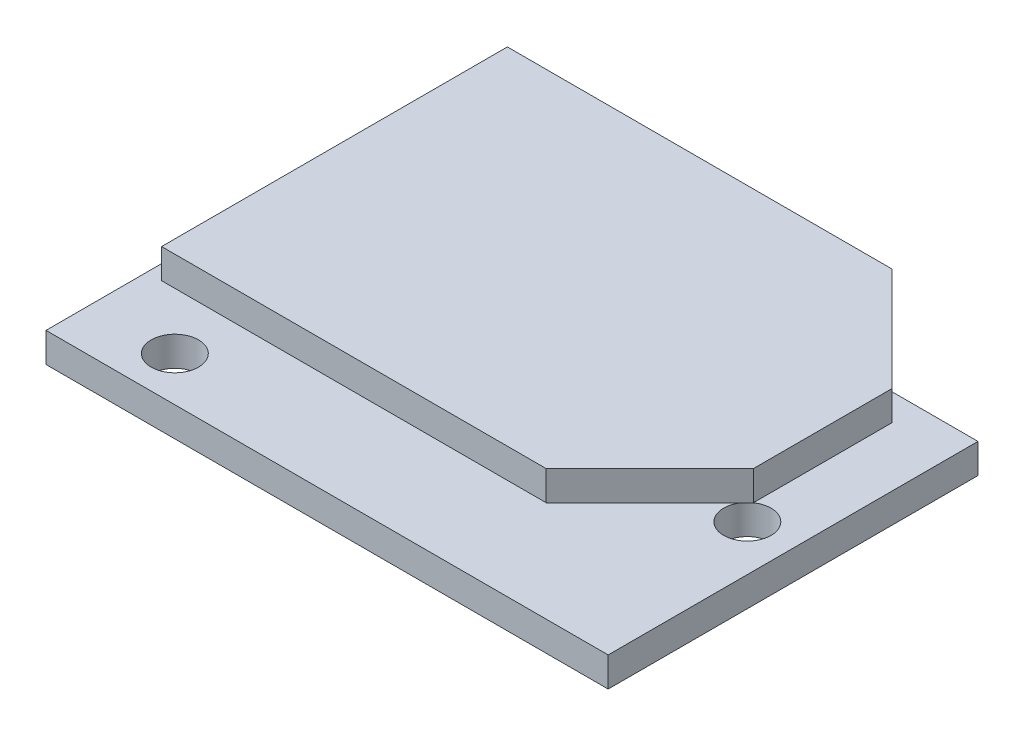
ISO-10303-21;
HEADER;
FILE_DESCRIPTION(('STEP AP214'),'2;1');
FILE_NAME('part.step','',(''),(''),'','','');
FILE_SCHEMA(('AUTOMOTIVE_DESIGN { 1 0 10303 214 1 1 1 1 }'));
ENDSEC;
DATA;
#1=APPLICATION_CONTEXT('core data for automotive mechanical design processes');
#2=APPLICATION_PROTOCOL_DEFINITION('international standard','automotive_design',2000,#1);
#3=PRODUCT_CONTEXT('',#1,'mechanical');
#4=PRODUCT('Part','Part','',(#3));
#5=PRODUCT_RELATED_PRODUCT_CATEGORY('part','',(#4));
#6=PRODUCT_DEFINITION_FORMATION('','',#4);
#7=PRODUCT_DEFINITION_CONTEXT('part definition',#1,'design');
#8=PRODUCT_DEFINITION('design','',#6,#7);
#9=PRODUCT_DEFINITION_SHAPE('','',#8);
#10=(LENGTH_UNIT() NAMED_UNIT(*) SI_UNIT(.MILLI.,.METRE.));
#11=(NAMED_UNIT(*) PLANE_ANGLE_UNIT() SI_UNIT($,.RADIAN.));
#12=(NAMED_UNIT(*) SI_UNIT($,.STERADIAN.) SOLID_ANGLE_UNIT());
#13=UNCERTAINTY_MEASURE_WITH_UNIT(LENGTH_MEASURE(1.E-05),#10,'distance_accuracy_value','');
#14=(GEOMETRIC_REPRESENTATION_CONTEXT(3) GLOBAL_UNCERTAINTY_ASSIGNED_CONTEXT((#13)) GLOBAL_UNIT_ASSIGNED_CONTEXT((#10,
#11,#12)) REPRESENTATION_CONTEXT('',''));
#15=CARTESIAN_POINT('',(0.,0.,0.));
#16=DIRECTION('',(0.,0.,1.));
#17=DIRECTION('',(1.,0.,0.));
#18=AXIS2_PLACEMENT_3D('',#15,#16,#17);
#19=CARTESIAN_POINT('',(7.,10.,-11.6864188731344));
#20=DIRECTION('',(1.,0.,0.));
#21=DIRECTION('',(0.,0.,-1.));
#22=AXIS2_PLACEMENT_3D('',#19,#20,#21);
#23=PLANE('',#22);
#24=DIRECTION('',(0.,0.,1.));
#25=VECTOR('',#24,1.);
#26=CARTESIAN_POINT('',(7.,8.,-11.6864188731344));
#27=LINE('',#26,#25);
#28=CARTESIAN_POINT('',(7.,8.,-11.6864188731344));
#29=VERTEX_POINT('',#28);
#30=CARTESIAN_POINT('',(7.,8.,11.6864188731344));
#31=VERTEX_POINT('',#30);
#32=EDGE_CURVE('E127',#29,#31,#27,.T.);
#33=ORIENTED_EDGE('',*,*,#32,.T.);
#34=DIRECTION('',(0.,-1.,0.));
#35=VECTOR('',#34,1.);
#36=CARTESIAN_POINT('',(7.,10.,11.6864188731344));
#37=LINE('',#36,#35);
#38=CARTESIAN_POINT('',(7.,10.,11.6864188731344));
#39=VERTEX_POINT('',#38);
#40=EDGE_CURVE('E12',#39,#31,#37,.T.);
#41=ORIENTED_EDGE('',*,*,#40,.F.);
#42=DIRECTION('',(0.,0.,1.));
#43=VECTOR('',#42,1.);
#44=CARTESIAN_POINT('',(7.,10.,-11.6864188731344));
#45=LINE('',#44,#43);
#46=CARTESIAN_POINT('',(7.,10.,-11.6864188731344));
#47=VERTEX_POINT('',#46);
#48=EDGE_CURVE('E137',#47,#39,#45,.T.);
#49=ORIENTED_EDGE('',*,*,#48,.F.);
#50=DIRECTION('',(0.,-1.,0.));
#51=VECTOR('',#50,1.);
#52=CARTESIAN_POINT('',(7.,10.,-11.6864188731344));
#53=LINE('',#52,#51);
#54=EDGE_CURVE('E123',#47,#29,#53,.T.);
#55=ORIENTED_EDGE('',*,*,#54,.T.);
#56=EDGE_LOOP('',(#33,#41,#49,#55));
#57=FACE_BOUND('',#56,.T.);
#58=ADVANCED_FACE('F43',(#57),#23,.F.);
#59=CARTESIAN_POINT('',(7.,10.,11.6864188731344));
#60=DIRECTION('',(0.,0.,-1.));
#61=DIRECTION('',(-1.,0.,0.));
#62=AXIS2_PLACEMENT_3D('',#59,#60,#61);
#63=PLANE('',#62);
#64=DIRECTION('',(1.,0.,0.));
#65=VECTOR('',#64,1.);
#66=CARTESIAN_POINT('',(7.,8.,11.6864188731344));
#67=LINE('',#66,#65);
#68=CARTESIAN_POINT('',(33.0000000000001,8.,11.6864188731344));
#69=VERTEX_POINT('',#68);
#70=EDGE_CURVE('E130',#31,#69,#67,.T.);
#71=ORIENTED_EDGE('',*,*,#70,.T.);
#72=DIRECTION('',(0.,-1.,0.));
#73=VECTOR('',#72,1.);
#74=CARTESIAN_POINT('',(33.0000000000001,10.,11.6864188731344));
#75=LINE('',#74,#73);
#76=CARTESIAN_POINT('',(33.0000000000001,10.,11.6864188731344));
#77=VERTEX_POINT('',#76);
#78=EDGE_CURVE('E51',#77,#69,#75,.T.);
#79=ORIENTED_EDGE('',*,*,#78,.F.);
#80=DIRECTION('',(1.,0.,0.));
#81=VECTOR('',#80,1.);
#82=CARTESIAN_POINT('',(7.,10.,11.6864188731344));
#83=LINE('',#82,#81);
#84=EDGE_CURVE('E96',#39,#77,#83,.T.);
#85=ORIENTED_EDGE('',*,*,#84,.F.);
#86=ORIENTED_EDGE('',*,*,#40,.T.);
#87=EDGE_LOOP('',(#71,#79,#85,#86));
#88=FACE_BOUND('',#87,.T.);
#89=ADVANCED_FACE('F161',(#88),#63,.F.);
#90=CARTESIAN_POINT('',(33.0000000000001,10.,11.6864188731344));
#91=DIRECTION('',(-0.707106781186549,0.,-0.707106781186546));
#92=DIRECTION('',(-0.707106781186546,0.,0.707106781186549));
#93=AXIS2_PLACEMENT_3D('',#90,#91,#92);
#94=PLANE('',#93);
#95=DIRECTION('',(0.707106781186546,0.,-0.707106781186549));
#96=VECTOR('',#95,1.);
#97=CARTESIAN_POINT('',(33.0000000000001,8.,11.6864188731344));
#98=LINE('',#97,#96);
#99=CARTESIAN_POINT('',(40.,8.,4.68641887313448));
#100=VERTEX_POINT('',#99);
#101=EDGE_CURVE('E132',#69,#100,#98,.T.);
#102=ORIENTED_EDGE('',*,*,#101,.T.);
#103=DIRECTION('',(0.,-1.,0.));
#104=VECTOR('',#103,1.);
#105=CARTESIAN_POINT('',(40.,10.,4.68641887313448));
#106=LINE('',#105,#104);
#107=CARTESIAN_POINT('',(40.,10.,4.68641887313448));
#108=VERTEX_POINT('',#107);
#109=EDGE_CURVE('E118',#108,#100,#106,.T.);
#110=ORIENTED_EDGE('',*,*,#109,.F.);
#111=DIRECTION('',(0.707106781186546,0.,-0.707106781186549));
#112=VECTOR('',#111,1.);
#113=CARTESIAN_POINT('',(33.0000000000001,10.,11.6864188731344));
#114=LINE('',#113,#112);
#115=EDGE_CURVE('E109',#77,#108,#114,.T.);
#116=ORIENTED_EDGE('',*,*,#115,.F.);
#117=ORIENTED_EDGE('',*,*,#78,.T.);
#118=EDGE_LOOP('',(#102,#110,#116,#117));
#119=FACE_BOUND('',#118,.T.);
#120=ADVANCED_FACE('F143',(#119),#94,.F.);
#121=CARTESIAN_POINT('',(40.,10.,4.68641887313448));
#122=DIRECTION('',(-1.,0.,0.));
#123=DIRECTION('',(0.,0.,1.));
#124=AXIS2_PLACEMENT_3D('',#121,#122,#123);
#125=PLANE('',#124);
#126=DIRECTION('',(0.,0.,-1.));
#127=VECTOR('',#126,1.);
#128=CARTESIAN_POINT('',(40.,8.,4.68641887313448));
#129=LINE('',#128,#127);
#130=CARTESIAN_POINT('',(40.,8.,-4.68641887313448));
#131=VERTEX_POINT('',#130);
#132=EDGE_CURVE('E117',#100,#131,#129,.T.);
#133=ORIENTED_EDGE('',*,*,#132,.T.);
#134=DIRECTION('',(0.,-1.,0.));
#135=VECTOR('',#134,1.);
#136=CARTESIAN_POINT('',(40.,10.,-4.68641887313448));
#137=LINE('',#136,#135);
#138=CARTESIAN_POINT('',(40.,10.,-4.68641887313448));
#139=VERTEX_POINT('',#138);
#140=EDGE_CURVE('E114',#139,#131,#137,.T.);
#141=ORIENTED_EDGE('',*,*,#140,.F.);
#142=DIRECTION('',(0.,0.,-1.));
#143=VECTOR('',#142,1.);
#144=CARTESIAN_POINT('',(40.,10.,4.68641887313448));
#145=LINE('',#144,#143);
#146=EDGE_CURVE('E103',#108,#139,#145,.T.);
#147=ORIENTED_EDGE('',*,*,#146,.F.);
#148=ORIENTED_EDGE('',*,*,#109,.T.);
#149=EDGE_LOOP('',(#133,#141,#147,#148));
#150=FACE_BOUND('',#149,.T.);
#151=ADVANCED_FACE('F115',(#150),#125,.F.);
#152=CARTESIAN_POINT('',(40.,10.,-4.68641887313448));
#153=DIRECTION('',(-0.707106781186544,0.,0.707106781186551));
#154=DIRECTION('',(0.707106781186551,0.,0.707106781186544));
#155=AXIS2_PLACEMENT_3D('',#152,#153,#154);
#156=PLANE('',#155);
#157=DIRECTION('',(-0.707106781186551,0.,-0.707106781186544));
#158=VECTOR('',#157,1.);
#159=CARTESIAN_POINT('',(40.,8.,-4.68641887313448));
#160=LINE('',#159,#158);
#161=CARTESIAN_POINT('',(33.,8.,-11.6864188731344));
#162=VERTEX_POINT('',#161);
#163=EDGE_CURVE('E82',#131,#162,#160,.T.);
#164=ORIENTED_EDGE('',*,*,#163,.T.);
#165=DIRECTION('',(0.,-1.,0.));
#166=VECTOR('',#165,1.);
#167=CARTESIAN_POINT('',(33.,10.,-11.6864188731344));
#168=LINE('',#167,#166);
#169=CARTESIAN_POINT('',(33.,10.,-11.6864188731344));
#170=VERTEX_POINT('',#169);
#171=EDGE_CURVE('E119',#170,#162,#168,.T.);
#172=ORIENTED_EDGE('',*,*,#171,.F.);
#173=DIRECTION('',(-0.707106781186551,0.,-0.707106781186544));
#174=VECTOR('',#173,1.);
#175=CARTESIAN_POINT('',(40.,10.,-4.68641887313448));
#176=LINE('',#175,#174);
#177=EDGE_CURVE('E107',#139,#170,#176,.T.);
#178=ORIENTED_EDGE('',*,*,#177,.F.);
#179=ORIENTED_EDGE('',*,*,#140,.T.);
#180=EDGE_LOOP('',(#164,#172,#178,#179));
#181=FACE_BOUND('',#180,.T.);
#182=ADVANCED_FACE('F121',(#181),#156,.F.);
#183=CARTESIAN_POINT('',(7.,10.,-11.6864188731344));
#184=DIRECTION('',(0.,0.,1.));
#185=DIRECTION('',(1.,0.,0.));
#186=AXIS2_PLACEMENT_3D('',#183,#184,#185);
#187=PLANE('',#186);
#188=DIRECTION('',(-1.,0.,0.));
#189=VECTOR('',#188,1.);
#190=CARTESIAN_POINT('',(7.,8.,-11.6864188731344));
#191=LINE('',#190,#189);
#192=EDGE_CURVE('E88',#162,#29,#191,.T.);
#193=ORIENTED_EDGE('',*,*,#192,.T.);
#194=ORIENTED_EDGE('',*,*,#54,.F.);
#195=DIRECTION('',(-1.,0.,0.));
#196=VECTOR('',#195,1.);
#197=CARTESIAN_POINT('',(7.,10.,-11.6864188731344));
#198=LINE('',#197,#196);
#199=EDGE_CURVE('E59',#170,#47,#198,.T.);
#200=ORIENTED_EDGE('',*,*,#199,.F.);
#201=ORIENTED_EDGE('',*,*,#171,.T.);
#202=EDGE_LOOP('',(#193,#194,#200,#201));
#203=FACE_BOUND('',#202,.T.);
#204=ADVANCED_FACE('F150',(#203),#187,.F.);
#205=CARTESIAN_POINT('',(0.,10.,0.));
#206=DIRECTION('',(0.,1.,0.));
#207=DIRECTION('',(0.,0.,1.));
#208=AXIS2_PLACEMENT_3D('',#205,#206,#207);
#209=PLANE('',#208);
#210=ORIENTED_EDGE('',*,*,#48,.T.);
#211=ORIENTED_EDGE('',*,*,#84,.T.);
#212=ORIENTED_EDGE('',*,*,#115,.T.);
#213=ORIENTED_EDGE('',*,*,#146,.T.);
#214=ORIENTED_EDGE('',*,*,#177,.T.);
#215=ORIENTED_EDGE('',*,*,#199,.T.);
#216=EDGE_LOOP('',(#210,#211,#212,#213,#214,#215));
#217=FACE_BOUND('',#216,.T.);
#218=ADVANCED_FACE('F105',(#217),#209,.T.);
#219=CARTESIAN_POINT('',(0.,8.,0.));
#220=DIRECTION('',(0.,1.,0.));
#221=DIRECTION('',(0.,0.,1.));
#222=AXIS2_PLACEMENT_3D('',#219,#220,#221);
#223=PLANE('',#222);
#224=ORIENTED_EDGE('',*,*,#32,.F.);
#225=ORIENTED_EDGE('',*,*,#192,.F.);
#226=ORIENTED_EDGE('',*,*,#163,.F.);
#227=ORIENTED_EDGE('',*,*,#132,.F.);
#228=ORIENTED_EDGE('',*,*,#101,.F.);
#229=ORIENTED_EDGE('',*,*,#70,.F.);
#230=EDGE_LOOP('',(#224,#225,#226,#227,#228,#229));
#231=FACE_BOUND('',#230,.T.);
#232=ADVANCED_FACE('F146',(#231),#223,.F.);
#233=CLOSED_SHELL('',(#58,#89,#120,#151,#182,#204,#218,#232));
#234=MANIFOLD_SOLID_BREP('B2',#233);
#235=CARTESIAN_POINT('',(0.,2.,0.));
#236=DIRECTION('',(0.,1.,0.));
#237=DIRECTION('',(0.,0.,1.));
#238=AXIS2_PLACEMENT_3D('',#235,#236,#237);
#239=PLANE('',#238);
#240=CARTESIAN_POINT('',(5.71,2.,9.5));
#241=DIRECTION('',(0.,1.,0.));
#242=DIRECTION('',(0.,0.,-1.));
#243=AXIS2_PLACEMENT_3D('',#240,#241,#242);
#244=CIRCLE('',#243,1.6);
#245=CARTESIAN_POINT('',(5.71,2.,7.9));
#246=VERTEX_POINT('',#245);
#247=EDGE_CURVE('E301',#246,#246,#244,.T.);
#248=ORIENTED_EDGE('',*,*,#247,.F.);
#249=EDGE_LOOP('',(#248));
#250=FACE_BOUND('',#249,.T.);
#251=DIRECTION('',(0.,0.,1.));
#252=VECTOR('',#251,1.);
#253=CARTESIAN_POINT('',(0.,2.,-12.5));
#254=LINE('',#253,#252);
#255=CARTESIAN_POINT('',(0.,2.,-12.5));
#256=VERTEX_POINT('',#255);
#257=CARTESIAN_POINT('',(0.,2.,12.5));
#258=VERTEX_POINT('',#257);
#259=EDGE_CURVE('E271',#256,#258,#254,.T.);
#260=ORIENTED_EDGE('',*,*,#259,.T.);
#261=DIRECTION('',(1.,0.,0.));
#262=VECTOR('',#261,1.);
#263=CARTESIAN_POINT('',(0.,2.,12.5));
#264=LINE('',#263,#262);
#265=CARTESIAN_POINT('',(38.,2.,12.5));
#266=VERTEX_POINT('',#265);
#267=EDGE_CURVE('E266',#258,#266,#264,.T.);
#268=ORIENTED_EDGE('',*,*,#267,.T.);
#269=DIRECTION('',(0.,0.,-1.));
#270=VECTOR('',#269,1.);
#271=CARTESIAN_POINT('',(38.,2.,-12.5));
#272=LINE('',#271,#270);
#273=CARTESIAN_POINT('',(38.,2.,-12.5));
#274=VERTEX_POINT('',#273);
#275=EDGE_CURVE('E269',#266,#274,#272,.T.);
#276=ORIENTED_EDGE('',*,*,#275,.T.);
#277=DIRECTION('',(-1.,0.,0.));
#278=VECTOR('',#277,1.);
#279=CARTESIAN_POINT('',(0.,2.,-12.5));
#280=LINE('',#279,#278);
#281=EDGE_CURVE('E236',#274,#256,#280,.T.);
#282=ORIENTED_EDGE('',*,*,#281,.T.);
#283=EDGE_LOOP('',(#260,#268,#276,#282));
#284=FACE_BOUND('',#283,.T.);
#285=CARTESIAN_POINT('',(5.71,2.,-9.5));
#286=DIRECTION('',(0.,1.,0.));
#287=DIRECTION('',(0.,0.,1.));
#288=AXIS2_PLACEMENT_3D('',#285,#286,#287);
#289=CIRCLE('',#288,1.6);
#290=CARTESIAN_POINT('',(5.71,2.,-7.9));
#291=VERTEX_POINT('',#290);
#292=EDGE_CURVE('E286',#291,#291,#289,.T.);
#293=ORIENTED_EDGE('',*,*,#292,.F.);
#294=EDGE_LOOP('',(#293));
#295=FACE_BOUND('',#294,.T.);
#296=CARTESIAN_POINT('',(34.91,2.,0.));
#297=DIRECTION('',(0.,1.,0.));
#298=DIRECTION('',(0.,0.,1.));
#299=AXIS2_PLACEMENT_3D('',#296,#297,#298);
#300=CIRCLE('',#299,1.6);
#301=CARTESIAN_POINT('',(34.91,2.,1.6));
#302=VERTEX_POINT('',#301);
#303=EDGE_CURVE('E307',#302,#302,#300,.T.);
#304=ORIENTED_EDGE('',*,*,#303,.F.);
#305=EDGE_LOOP('',(#304));
#306=FACE_BOUND('',#305,.T.);
#307=ADVANCED_FACE('F219',(#250,#284,#295,#306),#239,.T.);
#308=CARTESIAN_POINT('',(0.,0.,0.));
#309=DIRECTION('',(0.,1.,0.));
#310=DIRECTION('',(0.,0.,1.));
#311=AXIS2_PLACEMENT_3D('',#308,#309,#310);
#312=PLANE('',#311);
#313=DIRECTION('',(0.,0.,1.));
#314=VECTOR('',#313,1.);
#315=CARTESIAN_POINT('',(0.,0.,-12.5));
#316=LINE('',#315,#314);
#317=CARTESIAN_POINT('',(0.,0.,-12.5));
#318=VERTEX_POINT('',#317);
#319=CARTESIAN_POINT('',(0.,0.,12.5));
#320=VERTEX_POINT('',#319);
#321=EDGE_CURVE('E283',#318,#320,#316,.T.);
#322=ORIENTED_EDGE('',*,*,#321,.F.);
#323=DIRECTION('',(-1.,0.,0.));
#324=VECTOR('',#323,1.);
#325=CARTESIAN_POINT('',(0.,0.,-12.5));
#326=LINE('',#325,#324);
#327=CARTESIAN_POINT('',(38.,0.,-12.5));
#328=VERTEX_POINT('',#327);
#329=EDGE_CURVE('E259',#328,#318,#326,.T.);
#330=ORIENTED_EDGE('',*,*,#329,.F.);
#331=DIRECTION('',(0.,0.,-1.));
#332=VECTOR('',#331,1.);
#333=CARTESIAN_POINT('',(38.,0.,-12.5));
#334=LINE('',#333,#332);
#335=CARTESIAN_POINT('',(38.,0.,12.5));
#336=VERTEX_POINT('',#335);
#337=EDGE_CURVE('E253',#336,#328,#334,.T.);
#338=ORIENTED_EDGE('',*,*,#337,.F.);
#339=DIRECTION('',(1.,0.,0.));
#340=VECTOR('',#339,1.);
#341=CARTESIAN_POINT('',(0.,0.,12.5));
#342=LINE('',#341,#340);
#343=EDGE_CURVE('E275',#320,#336,#342,.T.);
#344=ORIENTED_EDGE('',*,*,#343,.F.);
#345=EDGE_LOOP('',(#322,#330,#338,#344));
#346=FACE_BOUND('',#345,.T.);
#347=CARTESIAN_POINT('',(5.71,0.,-9.5));
#348=DIRECTION('',(0.,1.,0.));
#349=DIRECTION('',(0.,0.,1.));
#350=AXIS2_PLACEMENT_3D('',#347,#348,#349);
#351=CIRCLE('',#350,1.6);
#352=CARTESIAN_POINT('',(5.71,0.,-7.9));
#353=VERTEX_POINT('',#352);
#354=EDGE_CURVE('E298',#353,#353,#351,.T.);
#355=ORIENTED_EDGE('',*,*,#354,.T.);
#356=EDGE_LOOP('',(#355));
#357=FACE_BOUND('',#356,.T.);
#358=CARTESIAN_POINT('',(5.71,0.,9.5));
#359=DIRECTION('',(0.,1.,0.));
#360=DIRECTION('',(0.,0.,-1.));
#361=AXIS2_PLACEMENT_3D('',#358,#359,#360);
#362=CIRCLE('',#361,1.6);
#363=CARTESIAN_POINT('',(5.71,0.,7.9));
#364=VERTEX_POINT('',#363);
#365=EDGE_CURVE('E304',#364,#364,#362,.T.);
#366=ORIENTED_EDGE('',*,*,#365,.T.);
#367=EDGE_LOOP('',(#366));
#368=FACE_BOUND('',#367,.T.);
#369=CARTESIAN_POINT('',(34.91,0.,0.));
#370=DIRECTION('',(0.,1.,0.));
#371=DIRECTION('',(0.,0.,1.));
#372=AXIS2_PLACEMENT_3D('',#369,#370,#371);
#373=CIRCLE('',#372,1.6);
#374=CARTESIAN_POINT('',(34.91,0.,1.6));
#375=VERTEX_POINT('',#374);
#376=EDGE_CURVE('E310',#375,#375,#373,.T.);
#377=ORIENTED_EDGE('',*,*,#376,.T.);
#378=EDGE_LOOP('',(#377));
#379=FACE_BOUND('',#378,.T.);
#380=ADVANCED_FACE('F294',(#346,#357,#368,#379),#312,.F.);
#381=CARTESIAN_POINT('',(0.,2.,-12.5));
#382=DIRECTION('',(1.,0.,0.));
#383=DIRECTION('',(0.,0.,-1.));
#384=AXIS2_PLACEMENT_3D('',#381,#382,#383);
#385=PLANE('',#384);
#386=ORIENTED_EDGE('',*,*,#321,.T.);
#387=DIRECTION('',(0.,-1.,0.));
#388=VECTOR('',#387,1.);
#389=CARTESIAN_POINT('',(0.,2.,12.5));
#390=LINE('',#389,#388);
#391=EDGE_CURVE('E41',#258,#320,#390,.T.);
#392=ORIENTED_EDGE('',*,*,#391,.F.);
#393=ORIENTED_EDGE('',*,*,#259,.F.);
#394=DIRECTION('',(0.,-1.,0.));
#395=VECTOR('',#394,1.);
#396=CARTESIAN_POINT('',(0.,2.,-12.5));
#397=LINE('',#396,#395);
#398=EDGE_CURVE('E279',#256,#318,#397,.T.);
#399=ORIENTED_EDGE('',*,*,#398,.T.);
#400=EDGE_LOOP('',(#386,#392,#393,#399));
#401=FACE_BOUND('',#400,.T.);
#402=ADVANCED_FACE('F221',(#401),#385,.F.);
#403=CARTESIAN_POINT('',(0.,2.,12.5));
#404=DIRECTION('',(0.,0.,-1.));
#405=DIRECTION('',(-1.,0.,0.));
#406=AXIS2_PLACEMENT_3D('',#403,#404,#405);
#407=PLANE('',#406);
#408=ORIENTED_EDGE('',*,*,#343,.T.);
#409=DIRECTION('',(0.,-1.,0.));
#410=VECTOR('',#409,1.);
#411=CARTESIAN_POINT('',(38.,2.,12.5));
#412=LINE('',#411,#410);
#413=EDGE_CURVE('E228',#266,#336,#412,.T.);
#414=ORIENTED_EDGE('',*,*,#413,.F.);
#415=ORIENTED_EDGE('',*,*,#267,.F.);
#416=ORIENTED_EDGE('',*,*,#391,.T.);
#417=EDGE_LOOP('',(#408,#414,#415,#416));
#418=FACE_BOUND('',#417,.T.);
#419=ADVANCED_FACE('F274',(#418),#407,.F.);
#420=CARTESIAN_POINT('',(38.,2.,-12.5));
#421=DIRECTION('',(-1.,0.,0.));
#422=DIRECTION('',(0.,0.,1.));
#423=AXIS2_PLACEMENT_3D('',#420,#421,#422);
#424=PLANE('',#423);
#425=ORIENTED_EDGE('',*,*,#337,.T.);
#426=DIRECTION('',(0.,-1.,0.));
#427=VECTOR('',#426,1.);
#428=CARTESIAN_POINT('',(38.,2.,-12.5));
#429=LINE('',#428,#427);
#430=EDGE_CURVE('E276',#274,#328,#429,.T.);
#431=ORIENTED_EDGE('',*,*,#430,.F.);
#432=ORIENTED_EDGE('',*,*,#275,.F.);
#433=ORIENTED_EDGE('',*,*,#413,.T.);
#434=EDGE_LOOP('',(#425,#431,#432,#433));
#435=FACE_BOUND('',#434,.T.);
#436=ADVANCED_FACE('F277',(#435),#424,.F.);
#437=CARTESIAN_POINT('',(0.,2.,-12.5));
#438=DIRECTION('',(0.,0.,1.));
#439=DIRECTION('',(1.,0.,0.));
#440=AXIS2_PLACEMENT_3D('',#437,#438,#439);
#441=PLANE('',#440);
#442=ORIENTED_EDGE('',*,*,#329,.T.);
#443=ORIENTED_EDGE('',*,*,#398,.F.);
#444=ORIENTED_EDGE('',*,*,#281,.F.);
#445=ORIENTED_EDGE('',*,*,#430,.T.);
#446=EDGE_LOOP('',(#442,#443,#444,#445));
#447=FACE_BOUND('',#446,.T.);
#448=ADVANCED_FACE('F291',(#447),#441,.F.);
#449=CARTESIAN_POINT('',(5.71,2.,-9.5));
#450=DIRECTION('',(0.,-1.,0.));
#451=DIRECTION('',(0.,0.,-1.));
#452=AXIS2_PLACEMENT_3D('',#449,#450,#451);
#453=CYLINDRICAL_SURFACE('',#452,1.6);
#454=ORIENTED_EDGE('',*,*,#292,.T.);
#455=EDGE_LOOP('',(#454));
#456=FACE_BOUND('',#455,.T.);
#457=ORIENTED_EDGE('',*,*,#354,.F.);
#458=EDGE_LOOP('',(#457));
#459=FACE_BOUND('',#458,.T.);
#460=ADVANCED_FACE('F328',(#456,#459),#453,.F.);
#461=CARTESIAN_POINT('',(5.71,2.,9.5));
#462=DIRECTION('',(0.,-1.,0.));
#463=DIRECTION('',(0.,0.,-1.));
#464=AXIS2_PLACEMENT_3D('',#461,#462,#463);
#465=CYLINDRICAL_SURFACE('',#464,1.6);
#466=ORIENTED_EDGE('',*,*,#247,.T.);
#467=EDGE_LOOP('',(#466));
#468=FACE_BOUND('',#467,.T.);
#469=ORIENTED_EDGE('',*,*,#365,.F.);
#470=EDGE_LOOP('',(#469));
#471=FACE_BOUND('',#470,.T.);
#472=ADVANCED_FACE('F374',(#468,#471),#465,.F.);
#473=CARTESIAN_POINT('',(34.91,2.,0.));
#474=DIRECTION('',(0.,-1.,0.));
#475=DIRECTION('',(0.,0.,-1.));
#476=AXIS2_PLACEMENT_3D('',#473,#474,#475);
#477=CYLINDRICAL_SURFACE('',#476,1.6);
#478=ORIENTED_EDGE('',*,*,#303,.T.);
#479=EDGE_LOOP('',(#478));
#480=FACE_BOUND('',#479,.T.);
#481=ORIENTED_EDGE('',*,*,#376,.F.);
#482=EDGE_LOOP('',(#481));
#483=FACE_BOUND('',#482,.T.);
#484=ADVANCED_FACE('F316',(#480,#483),#477,.F.);
#485=CLOSED_SHELL('',(#307,#380,#402,#419,#436,#448,#460,#472,#484));
#486=MANIFOLD_SOLID_BREP('B6',#485);
#487=ADVANCED_BREP_SHAPE_REPRESENTATION('',(#18,#234,#486),#14);
#488=SHAPE_DEFINITION_REPRESENTATION(#9,#487);
ENDSEC;
END-ISO-10303-21;
